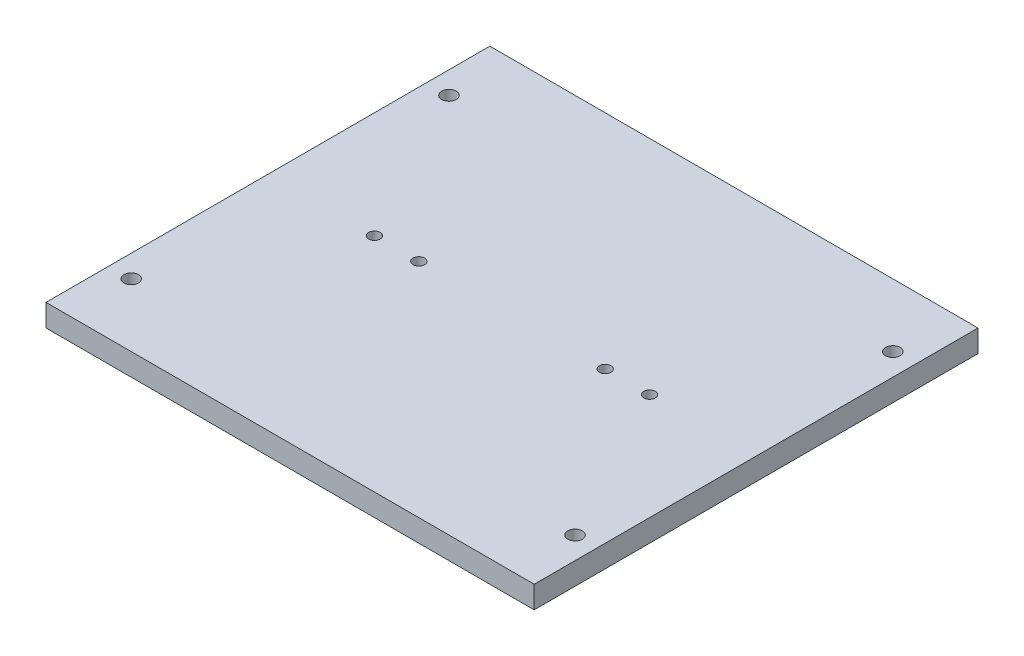
ISO-10303-21;
HEADER;
FILE_DESCRIPTION(('STEP AP214'),'2;1');
FILE_NAME('part.step','',(''),(''),'','','');
FILE_SCHEMA(('AUTOMOTIVE_DESIGN { 1 0 10303 214 1 1 1 1 }'));
ENDSEC;
DATA;
#1=APPLICATION_CONTEXT('core data for automotive mechanical design processes');
#2=APPLICATION_PROTOCOL_DEFINITION('international standard','automotive_design',2000,#1);
#3=PRODUCT_CONTEXT('',#1,'mechanical');
#4=PRODUCT('Part','Part','',(#3));
#5=PRODUCT_RELATED_PRODUCT_CATEGORY('part','',(#4));
#6=PRODUCT_DEFINITION_FORMATION('','',#4);
#7=PRODUCT_DEFINITION_CONTEXT('part definition',#1,'design');
#8=PRODUCT_DEFINITION('design','',#6,#7);
#9=PRODUCT_DEFINITION_SHAPE('','',#8);
#10=(LENGTH_UNIT() NAMED_UNIT(*) SI_UNIT(.MILLI.,.METRE.));
#11=(NAMED_UNIT(*) PLANE_ANGLE_UNIT() SI_UNIT($,.RADIAN.));
#12=(NAMED_UNIT(*) SI_UNIT($,.STERADIAN.) SOLID_ANGLE_UNIT());
#13=UNCERTAINTY_MEASURE_WITH_UNIT(LENGTH_MEASURE(1.E-05),#10,'distance_accuracy_value','');
#14=(GEOMETRIC_REPRESENTATION_CONTEXT(3) GLOBAL_UNCERTAINTY_ASSIGNED_CONTEXT((#13)) GLOBAL_UNIT_ASSIGNED_CONTEXT((#10,
#11,#12)) REPRESENTATION_CONTEXT('',''));
#15=CARTESIAN_POINT('',(0.,0.,0.));
#16=DIRECTION('',(0.,0.,1.));
#17=DIRECTION('',(1.,0.,0.));
#18=AXIS2_PLACEMENT_3D('',#15,#16,#17);
#19=CARTESIAN_POINT('',(0.,6.35,0.));
#20=DIRECTION('',(0.,-1.,0.));
#21=DIRECTION('',(0.,0.,-1.));
#22=AXIS2_PLACEMENT_3D('',#19,#20,#21);
#23=PLANE('',#22);
#24=DIRECTION('',(0.,0.,-1.));
#25=VECTOR('',#24,1.);
#26=CARTESIAN_POINT('',(139.7,6.35,-190.5));
#27=LINE('',#26,#25);
#28=CARTESIAN_POINT('',(139.7,6.35,-63.5));
#29=VERTEX_POINT('',#28);
#30=CARTESIAN_POINT('',(139.7,6.35,-190.5));
#31=VERTEX_POINT('',#30);
#32=EDGE_CURVE('E85',#29,#31,#27,.T.);
#33=ORIENTED_EDGE('',*,*,#32,.T.);
#34=DIRECTION('',(-1.,0.,0.));
#35=VECTOR('',#34,1.);
#36=CARTESIAN_POINT('',(0.,6.35,-190.5));
#37=LINE('',#36,#35);
#38=CARTESIAN_POINT('',(0.,6.35,-190.5));
#39=VERTEX_POINT('',#38);
#40=EDGE_CURVE('E80',#31,#39,#37,.T.);
#41=ORIENTED_EDGE('',*,*,#40,.T.);
#42=DIRECTION('',(0.,0.,1.));
#43=VECTOR('',#42,1.);
#44=CARTESIAN_POINT('',(0.,6.35,-63.5));
#45=LINE('',#44,#43);
#46=CARTESIAN_POINT('',(0.,6.35,-63.5));
#47=VERTEX_POINT('',#46);
#48=EDGE_CURVE('E83',#39,#47,#45,.T.);
#49=ORIENTED_EDGE('',*,*,#48,.T.);
#50=DIRECTION('',(1.,0.,0.));
#51=VECTOR('',#50,1.);
#52=CARTESIAN_POINT('',(139.7,6.35,-63.5));
#53=LINE('',#52,#51);
#54=EDGE_CURVE('E50',#47,#29,#53,.T.);
#55=ORIENTED_EDGE('',*,*,#54,.T.);
#56=EDGE_LOOP('',(#33,#41,#49,#55));
#57=FACE_BOUND('',#56,.T.);
#58=CARTESIAN_POINT('',(133.35,6.35,-172.466));
#59=DIRECTION('',(0.,1.,0.));
#60=DIRECTION('',(0.,0.,1.));
#61=AXIS2_PLACEMENT_3D('',#58,#59,#60);
#62=CIRCLE('',#61,2.08279999999998);
#63=CARTESIAN_POINT('',(133.35,6.35,-170.3832));
#64=VERTEX_POINT('',#63);
#65=EDGE_CURVE('E100',#64,#64,#62,.T.);
#66=ORIENTED_EDGE('',*,*,#65,.F.);
#67=EDGE_LOOP('',(#66));
#68=FACE_BOUND('',#67,.T.);
#69=CARTESIAN_POINT('',(133.35,6.35,-81.534));
#70=DIRECTION('',(0.,1.,0.));
#71=DIRECTION('',(0.,0.,-1.));
#72=AXIS2_PLACEMENT_3D('',#69,#70,#71);
#73=CIRCLE('',#72,2.08279999999999);
#74=CARTESIAN_POINT('',(133.35,6.35,-83.6168));
#75=VERTEX_POINT('',#74);
#76=EDGE_CURVE('E115',#75,#75,#73,.T.);
#77=ORIENTED_EDGE('',*,*,#76,.F.);
#78=EDGE_LOOP('',(#77));
#79=FACE_BOUND('',#78,.T.);
#80=CARTESIAN_POINT('',(6.35000000000002,6.35,-172.466));
#81=DIRECTION('',(0.,1.,0.));
#82=DIRECTION('',(0.,0.,-1.));
#83=AXIS2_PLACEMENT_3D('',#80,#81,#82);
#84=CIRCLE('',#83,2.0828);
#85=CARTESIAN_POINT('',(6.35000000000002,6.35,-174.5488));
#86=VERTEX_POINT('',#85);
#87=EDGE_CURVE('E121',#86,#86,#84,.T.);
#88=ORIENTED_EDGE('',*,*,#87,.F.);
#89=EDGE_LOOP('',(#88));
#90=FACE_BOUND('',#89,.T.);
#91=CARTESIAN_POINT('',(6.35000000000002,6.35,-81.534));
#92=DIRECTION('',(0.,1.,0.));
#93=DIRECTION('',(0.,0.,1.));
#94=AXIS2_PLACEMENT_3D('',#91,#92,#93);
#95=CIRCLE('',#94,2.0828);
#96=CARTESIAN_POINT('',(6.35000000000002,6.35,-79.4512));
#97=VERTEX_POINT('',#96);
#98=EDGE_CURVE('E127',#97,#97,#95,.T.);
#99=ORIENTED_EDGE('',*,*,#98,.F.);
#100=EDGE_LOOP('',(#99));
#101=FACE_BOUND('',#100,.T.);
#102=CARTESIAN_POINT('',(109.22,6.35,-127.));
#103=DIRECTION('',(0.,1.,0.));
#104=DIRECTION('',(0.,0.,1.));
#105=AXIS2_PLACEMENT_3D('',#102,#103,#104);
#106=CIRCLE('',#105,1.65100000000001);
#107=CARTESIAN_POINT('',(109.22,6.35,-125.349));
#108=VERTEX_POINT('',#107);
#109=EDGE_CURVE('E133',#108,#108,#106,.T.);
#110=ORIENTED_EDGE('',*,*,#109,.F.);
#111=EDGE_LOOP('',(#110));
#112=FACE_BOUND('',#111,.T.);
#113=CARTESIAN_POINT('',(96.5199999999999,6.35,-127.));
#114=DIRECTION('',(0.,1.,0.));
#115=DIRECTION('',(0.,0.,1.));
#116=AXIS2_PLACEMENT_3D('',#113,#114,#115);
#117=CIRCLE('',#116,1.65100000000001);
#118=CARTESIAN_POINT('',(96.5199999999999,6.35,-125.349));
#119=VERTEX_POINT('',#118);
#120=EDGE_CURVE('E139',#119,#119,#117,.T.);
#121=ORIENTED_EDGE('',*,*,#120,.F.);
#122=EDGE_LOOP('',(#121));
#123=FACE_BOUND('',#122,.T.);
#124=CARTESIAN_POINT('',(43.18,6.35,-127.));
#125=DIRECTION('',(0.,1.,0.));
#126=DIRECTION('',(0.,0.,-1.));
#127=AXIS2_PLACEMENT_3D('',#124,#125,#126);
#128=CIRCLE('',#127,1.65100000000002);
#129=CARTESIAN_POINT('',(43.18,6.35,-128.651));
#130=VERTEX_POINT('',#129);
#131=EDGE_CURVE('E145',#130,#130,#128,.T.);
#132=ORIENTED_EDGE('',*,*,#131,.F.);
#133=EDGE_LOOP('',(#132));
#134=FACE_BOUND('',#133,.T.);
#135=CARTESIAN_POINT('',(30.48,6.35,-127.));
#136=DIRECTION('',(0.,1.,0.));
#137=DIRECTION('',(0.,0.,-1.));
#138=AXIS2_PLACEMENT_3D('',#135,#136,#137);
#139=CIRCLE('',#138,1.65100000000002);
#140=CARTESIAN_POINT('',(30.48,6.35,-128.651));
#141=VERTEX_POINT('',#140);
#142=EDGE_CURVE('E151',#141,#141,#139,.T.);
#143=ORIENTED_EDGE('',*,*,#142,.F.);
#144=EDGE_LOOP('',(#143));
#145=FACE_BOUND('',#144,.T.);
#146=ADVANCED_FACE('F33',(#57,#68,#79,#90,#101,#112,#123,#134,#145),#23,.F.);
#147=CARTESIAN_POINT('',(0.,0.,0.));
#148=DIRECTION('',(0.,-1.,0.));
#149=DIRECTION('',(0.,0.,-1.));
#150=AXIS2_PLACEMENT_3D('',#147,#148,#149);
#151=PLANE('',#150);
#152=CARTESIAN_POINT('',(43.18,0.,-127.));
#153=DIRECTION('',(0.,1.,0.));
#154=DIRECTION('',(0.,0.,-1.));
#155=AXIS2_PLACEMENT_3D('',#152,#153,#154);
#156=CIRCLE('',#155,1.65100000000002);
#157=CARTESIAN_POINT('',(43.18,0.,-128.651));
#158=VERTEX_POINT('',#157);
#159=EDGE_CURVE('E148',#158,#158,#156,.T.);
#160=ORIENTED_EDGE('',*,*,#159,.T.);
#161=EDGE_LOOP('',(#160));
#162=FACE_BOUND('',#161,.T.);
#163=CARTESIAN_POINT('',(109.22,0.,-127.));
#164=DIRECTION('',(0.,1.,0.));
#165=DIRECTION('',(0.,0.,1.));
#166=AXIS2_PLACEMENT_3D('',#163,#164,#165);
#167=CIRCLE('',#166,1.65100000000001);
#168=CARTESIAN_POINT('',(109.22,0.,-125.349));
#169=VERTEX_POINT('',#168);
#170=EDGE_CURVE('E136',#169,#169,#167,.T.);
#171=ORIENTED_EDGE('',*,*,#170,.T.);
#172=EDGE_LOOP('',(#171));
#173=FACE_BOUND('',#172,.T.);
#174=CARTESIAN_POINT('',(6.35000000000002,0.,-172.466));
#175=DIRECTION('',(0.,1.,0.));
#176=DIRECTION('',(0.,0.,-1.));
#177=AXIS2_PLACEMENT_3D('',#174,#175,#176);
#178=CIRCLE('',#177,2.0828);
#179=CARTESIAN_POINT('',(6.35000000000002,0.,-174.5488));
#180=VERTEX_POINT('',#179);
#181=EDGE_CURVE('E124',#180,#180,#178,.T.);
#182=ORIENTED_EDGE('',*,*,#181,.T.);
#183=EDGE_LOOP('',(#182));
#184=FACE_BOUND('',#183,.T.);
#185=CARTESIAN_POINT('',(133.35,0.,-172.466));
#186=DIRECTION('',(0.,1.,0.));
#187=DIRECTION('',(0.,0.,1.));
#188=AXIS2_PLACEMENT_3D('',#185,#186,#187);
#189=CIRCLE('',#188,2.08279999999998);
#190=CARTESIAN_POINT('',(133.35,0.,-170.3832));
#191=VERTEX_POINT('',#190);
#192=EDGE_CURVE('E112',#191,#191,#189,.T.);
#193=ORIENTED_EDGE('',*,*,#192,.T.);
#194=EDGE_LOOP('',(#193));
#195=FACE_BOUND('',#194,.T.);
#196=DIRECTION('',(0.,0.,-1.));
#197=VECTOR('',#196,1.);
#198=CARTESIAN_POINT('',(139.7,0.,-190.5));
#199=LINE('',#198,#197);
#200=CARTESIAN_POINT('',(139.7,0.,-63.5));
#201=VERTEX_POINT('',#200);
#202=CARTESIAN_POINT('',(139.7,0.,-190.5));
#203=VERTEX_POINT('',#202);
#204=EDGE_CURVE('E97',#201,#203,#199,.T.);
#205=ORIENTED_EDGE('',*,*,#204,.F.);
#206=DIRECTION('',(1.,0.,0.));
#207=VECTOR('',#206,1.);
#208=CARTESIAN_POINT('',(139.7,0.,-63.5));
#209=LINE('',#208,#207);
#210=CARTESIAN_POINT('',(0.,0.,-63.5));
#211=VERTEX_POINT('',#210);
#212=EDGE_CURVE('E73',#211,#201,#209,.T.);
#213=ORIENTED_EDGE('',*,*,#212,.F.);
#214=DIRECTION('',(0.,0.,1.));
#215=VECTOR('',#214,1.);
#216=CARTESIAN_POINT('',(0.,0.,-63.5));
#217=LINE('',#216,#215);
#218=CARTESIAN_POINT('',(0.,0.,-190.5));
#219=VERTEX_POINT('',#218);
#220=EDGE_CURVE('E67',#219,#211,#217,.T.);
#221=ORIENTED_EDGE('',*,*,#220,.F.);
#222=DIRECTION('',(-1.,0.,0.));
#223=VECTOR('',#222,1.);
#224=CARTESIAN_POINT('',(0.,0.,-190.5));
#225=LINE('',#224,#223);
#226=EDGE_CURVE('E89',#203,#219,#225,.T.);
#227=ORIENTED_EDGE('',*,*,#226,.F.);
#228=EDGE_LOOP('',(#205,#213,#221,#227));
#229=FACE_BOUND('',#228,.T.);
#230=CARTESIAN_POINT('',(133.35,0.,-81.534));
#231=DIRECTION('',(0.,1.,0.));
#232=DIRECTION('',(0.,0.,-1.));
#233=AXIS2_PLACEMENT_3D('',#230,#231,#232);
#234=CIRCLE('',#233,2.08279999999999);
#235=CARTESIAN_POINT('',(133.35,0.,-83.6168));
#236=VERTEX_POINT('',#235);
#237=EDGE_CURVE('E118',#236,#236,#234,.T.);
#238=ORIENTED_EDGE('',*,*,#237,.T.);
#239=EDGE_LOOP('',(#238));
#240=FACE_BOUND('',#239,.T.);
#241=CARTESIAN_POINT('',(6.35000000000002,0.,-81.534));
#242=DIRECTION('',(0.,1.,0.));
#243=DIRECTION('',(0.,0.,1.));
#244=AXIS2_PLACEMENT_3D('',#241,#242,#243);
#245=CIRCLE('',#244,2.0828);
#246=CARTESIAN_POINT('',(6.35000000000002,0.,-79.4512));
#247=VERTEX_POINT('',#246);
#248=EDGE_CURVE('E130',#247,#247,#245,.T.);
#249=ORIENTED_EDGE('',*,*,#248,.T.);
#250=EDGE_LOOP('',(#249));
#251=FACE_BOUND('',#250,.T.);
#252=CARTESIAN_POINT('',(96.5199999999999,0.,-127.));
#253=DIRECTION('',(0.,1.,0.));
#254=DIRECTION('',(0.,0.,1.));
#255=AXIS2_PLACEMENT_3D('',#252,#253,#254);
#256=CIRCLE('',#255,1.65100000000001);
#257=CARTESIAN_POINT('',(96.5199999999999,0.,-125.349));
#258=VERTEX_POINT('',#257);
#259=EDGE_CURVE('E142',#258,#258,#256,.T.);
#260=ORIENTED_EDGE('',*,*,#259,.T.);
#261=EDGE_LOOP('',(#260));
#262=FACE_BOUND('',#261,.T.);
#263=CARTESIAN_POINT('',(30.48,0.,-127.));
#264=DIRECTION('',(0.,1.,0.));
#265=DIRECTION('',(0.,0.,-1.));
#266=AXIS2_PLACEMENT_3D('',#263,#264,#265);
#267=CIRCLE('',#266,1.65100000000002);
#268=CARTESIAN_POINT('',(30.48,0.,-128.651));
#269=VERTEX_POINT('',#268);
#270=EDGE_CURVE('E154',#269,#269,#267,.T.);
#271=ORIENTED_EDGE('',*,*,#270,.T.);
#272=EDGE_LOOP('',(#271));
#273=FACE_BOUND('',#272,.T.);
#274=ADVANCED_FACE('F108',(#162,#173,#184,#195,#229,#240,#251,#262,#273),#151,.T.);
#275=CARTESIAN_POINT('',(139.7,6.35,-190.5));
#276=DIRECTION('',(-1.,0.,0.));
#277=DIRECTION('',(0.,0.,1.));
#278=AXIS2_PLACEMENT_3D('',#275,#276,#277);
#279=PLANE('',#278);
#280=ORIENTED_EDGE('',*,*,#204,.T.);
#281=DIRECTION('',(0.,-1.,0.));
#282=VECTOR('',#281,1.);
#283=CARTESIAN_POINT('',(139.7,6.35,-190.5));
#284=LINE('',#283,#282);
#285=EDGE_CURVE('E11',#31,#203,#284,.T.);
#286=ORIENTED_EDGE('',*,*,#285,.F.);
#287=ORIENTED_EDGE('',*,*,#32,.F.);
#288=DIRECTION('',(0.,-1.,0.));
#289=VECTOR('',#288,1.);
#290=CARTESIAN_POINT('',(139.7,6.35,-63.5));
#291=LINE('',#290,#289);
#292=EDGE_CURVE('E93',#29,#201,#291,.T.);
#293=ORIENTED_EDGE('',*,*,#292,.T.);
#294=EDGE_LOOP('',(#280,#286,#287,#293));
#295=FACE_BOUND('',#294,.T.);
#296=ADVANCED_FACE('F35',(#295),#279,.F.);
#297=CARTESIAN_POINT('',(0.,6.35,-190.5));
#298=DIRECTION('',(0.,0.,1.));
#299=DIRECTION('',(1.,0.,0.));
#300=AXIS2_PLACEMENT_3D('',#297,#298,#299);
#301=PLANE('',#300);
#302=ORIENTED_EDGE('',*,*,#226,.T.);
#303=DIRECTION('',(0.,-1.,0.));
#304=VECTOR('',#303,1.);
#305=CARTESIAN_POINT('',(0.,6.35,-190.5));
#306=LINE('',#305,#304);
#307=EDGE_CURVE('E42',#39,#219,#306,.T.);
#308=ORIENTED_EDGE('',*,*,#307,.F.);
#309=ORIENTED_EDGE('',*,*,#40,.F.);
#310=ORIENTED_EDGE('',*,*,#285,.T.);
#311=EDGE_LOOP('',(#302,#308,#309,#310));
#312=FACE_BOUND('',#311,.T.);
#313=ADVANCED_FACE('F88',(#312),#301,.F.);
#314=CARTESIAN_POINT('',(0.,6.35,-63.5));
#315=DIRECTION('',(1.,0.,0.));
#316=DIRECTION('',(0.,0.,-1.));
#317=AXIS2_PLACEMENT_3D('',#314,#315,#316);
#318=PLANE('',#317);
#319=ORIENTED_EDGE('',*,*,#220,.T.);
#320=DIRECTION('',(0.,-1.,0.));
#321=VECTOR('',#320,1.);
#322=CARTESIAN_POINT('',(0.,6.35,-63.5));
#323=LINE('',#322,#321);
#324=EDGE_CURVE('E90',#47,#211,#323,.T.);
#325=ORIENTED_EDGE('',*,*,#324,.F.);
#326=ORIENTED_EDGE('',*,*,#48,.F.);
#327=ORIENTED_EDGE('',*,*,#307,.T.);
#328=EDGE_LOOP('',(#319,#325,#326,#327));
#329=FACE_BOUND('',#328,.T.);
#330=ADVANCED_FACE('F91',(#329),#318,.F.);
#331=CARTESIAN_POINT('',(139.7,6.35,-63.5));
#332=DIRECTION('',(0.,0.,-1.));
#333=DIRECTION('',(-1.,0.,0.));
#334=AXIS2_PLACEMENT_3D('',#331,#332,#333);
#335=PLANE('',#334);
#336=ORIENTED_EDGE('',*,*,#212,.T.);
#337=ORIENTED_EDGE('',*,*,#292,.F.);
#338=ORIENTED_EDGE('',*,*,#54,.F.);
#339=ORIENTED_EDGE('',*,*,#324,.T.);
#340=EDGE_LOOP('',(#336,#337,#338,#339));
#341=FACE_BOUND('',#340,.T.);
#342=ADVANCED_FACE('F105',(#341),#335,.F.);
#343=CARTESIAN_POINT('',(133.35,6.35,-172.466));
#344=DIRECTION('',(0.,-1.,0.));
#345=DIRECTION('',(0.,0.,-1.));
#346=AXIS2_PLACEMENT_3D('',#343,#344,#345);
#347=CYLINDRICAL_SURFACE('',#346,2.08279999999998);
#348=ORIENTED_EDGE('',*,*,#65,.T.);
#349=EDGE_LOOP('',(#348));
#350=FACE_BOUND('',#349,.T.);
#351=ORIENTED_EDGE('',*,*,#192,.F.);
#352=EDGE_LOOP('',(#351));
#353=FACE_BOUND('',#352,.T.);
#354=ADVANCED_FACE('F171',(#350,#353),#347,.F.);
#355=CARTESIAN_POINT('',(133.35,6.35,-81.534));
#356=DIRECTION('',(0.,-1.,0.));
#357=DIRECTION('',(0.,0.,-1.));
#358=AXIS2_PLACEMENT_3D('',#355,#356,#357);
#359=CYLINDRICAL_SURFACE('',#358,2.08279999999999);
#360=ORIENTED_EDGE('',*,*,#76,.T.);
#361=EDGE_LOOP('',(#360));
#362=FACE_BOUND('',#361,.T.);
#363=ORIENTED_EDGE('',*,*,#237,.F.);
#364=EDGE_LOOP('',(#363));
#365=FACE_BOUND('',#364,.T.);
#366=ADVANCED_FACE('F217',(#362,#365),#359,.F.);
#367=CARTESIAN_POINT('',(6.35000000000002,6.35,-172.466));
#368=DIRECTION('',(0.,-1.,0.));
#369=DIRECTION('',(0.,0.,-1.));
#370=AXIS2_PLACEMENT_3D('',#367,#368,#369);
#371=CYLINDRICAL_SURFACE('',#370,2.0828);
#372=ORIENTED_EDGE('',*,*,#87,.T.);
#373=EDGE_LOOP('',(#372));
#374=FACE_BOUND('',#373,.T.);
#375=ORIENTED_EDGE('',*,*,#181,.F.);
#376=EDGE_LOOP('',(#375));
#377=FACE_BOUND('',#376,.T.);
#378=ADVANCED_FACE('F225',(#374,#377),#371,.F.);
#379=CARTESIAN_POINT('',(6.35000000000002,6.35,-81.534));
#380=DIRECTION('',(0.,-1.,0.));
#381=DIRECTION('',(0.,0.,-1.));
#382=AXIS2_PLACEMENT_3D('',#379,#380,#381);
#383=CYLINDRICAL_SURFACE('',#382,2.0828);
#384=ORIENTED_EDGE('',*,*,#98,.T.);
#385=EDGE_LOOP('',(#384));
#386=FACE_BOUND('',#385,.T.);
#387=ORIENTED_EDGE('',*,*,#248,.F.);
#388=EDGE_LOOP('',(#387));
#389=FACE_BOUND('',#388,.T.);
#390=ADVANCED_FACE('F233',(#386,#389),#383,.F.);
#391=CARTESIAN_POINT('',(109.22,6.35,-127.));
#392=DIRECTION('',(0.,-1.,0.));
#393=DIRECTION('',(0.,0.,-1.));
#394=AXIS2_PLACEMENT_3D('',#391,#392,#393);
#395=CYLINDRICAL_SURFACE('',#394,1.65100000000001);
#396=ORIENTED_EDGE('',*,*,#109,.T.);
#397=EDGE_LOOP('',(#396));
#398=FACE_BOUND('',#397,.T.);
#399=ORIENTED_EDGE('',*,*,#170,.F.);
#400=EDGE_LOOP('',(#399));
#401=FACE_BOUND('',#400,.T.);
#402=ADVANCED_FACE('F242',(#398,#401),#395,.F.);
#403=CARTESIAN_POINT('',(96.5199999999999,6.35,-127.));
#404=DIRECTION('',(0.,-1.,0.));
#405=DIRECTION('',(0.,0.,-1.));
#406=AXIS2_PLACEMENT_3D('',#403,#404,#405);
#407=CYLINDRICAL_SURFACE('',#406,1.65100000000001);
#408=ORIENTED_EDGE('',*,*,#120,.T.);
#409=EDGE_LOOP('',(#408));
#410=FACE_BOUND('',#409,.T.);
#411=ORIENTED_EDGE('',*,*,#259,.F.);
#412=EDGE_LOOP('',(#411));
#413=FACE_BOUND('',#412,.T.);
#414=ADVANCED_FACE('F251',(#410,#413),#407,.F.);
#415=CARTESIAN_POINT('',(43.18,6.35,-127.));
#416=DIRECTION('',(0.,-1.,0.));
#417=DIRECTION('',(0.,0.,-1.));
#418=AXIS2_PLACEMENT_3D('',#415,#416,#417);
#419=CYLINDRICAL_SURFACE('',#418,1.65100000000002);
#420=ORIENTED_EDGE('',*,*,#131,.T.);
#421=EDGE_LOOP('',(#420));
#422=FACE_BOUND('',#421,.T.);
#423=ORIENTED_EDGE('',*,*,#159,.F.);
#424=EDGE_LOOP('',(#423));
#425=FACE_BOUND('',#424,.T.);
#426=ADVANCED_FACE('F260',(#422,#425),#419,.F.);
#427=CARTESIAN_POINT('',(30.48,6.35,-127.));
#428=DIRECTION('',(0.,-1.,0.));
#429=DIRECTION('',(0.,0.,-1.));
#430=AXIS2_PLACEMENT_3D('',#427,#428,#429);
#431=CYLINDRICAL_SURFACE('',#430,1.65100000000002);
#432=ORIENTED_EDGE('',*,*,#142,.T.);
#433=EDGE_LOOP('',(#432));
#434=FACE_BOUND('',#433,.T.);
#435=ORIENTED_EDGE('',*,*,#270,.F.);
#436=EDGE_LOOP('',(#435));
#437=FACE_BOUND('',#436,.T.);
#438=ADVANCED_FACE('F160',(#434,#437),#431,.F.);
#439=CLOSED_SHELL('',(#146,#274,#296,#313,#330,#342,#354,#366,#378,#390,#402,#414,#426,#438));
#440=MANIFOLD_SOLID_BREP('B2',#439);
#441=ADVANCED_BREP_SHAPE_REPRESENTATION('',(#18,#440),#14);
#442=SHAPE_DEFINITION_REPRESENTATION(#9,#441);
ENDSEC;
END-ISO-10303-21;
